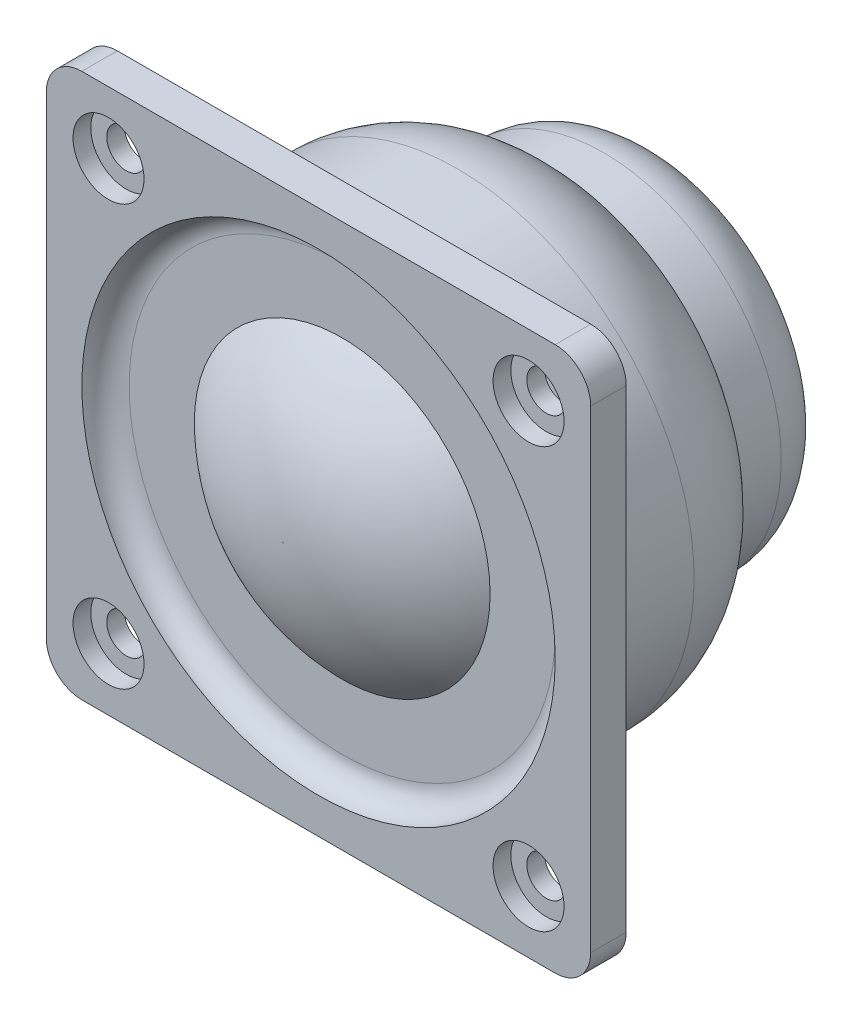
ISO-10303-21;
HEADER;
FILE_DESCRIPTION(('STEP AP214'),'2;1');
FILE_NAME('part.step','',(''),(''),'','','');
FILE_SCHEMA(('AUTOMOTIVE_DESIGN { 1 0 10303 214 1 1 1 1 }'));
ENDSEC;
DATA;
#1=APPLICATION_CONTEXT('core data for automotive mechanical design processes');
#2=APPLICATION_PROTOCOL_DEFINITION('international standard','automotive_design',2000,#1);
#3=PRODUCT_CONTEXT('',#1,'mechanical');
#4=PRODUCT('Part','Part','',(#3));
#5=PRODUCT_RELATED_PRODUCT_CATEGORY('part','',(#4));
#6=PRODUCT_DEFINITION_FORMATION('','',#4);
#7=PRODUCT_DEFINITION_CONTEXT('part definition',#1,'design');
#8=PRODUCT_DEFINITION('design','',#6,#7);
#9=PRODUCT_DEFINITION_SHAPE('','',#8);
#10=(LENGTH_UNIT() NAMED_UNIT(*) SI_UNIT(.MILLI.,.METRE.));
#11=(NAMED_UNIT(*) PLANE_ANGLE_UNIT() SI_UNIT($,.RADIAN.));
#12=(NAMED_UNIT(*) SI_UNIT($,.STERADIAN.) SOLID_ANGLE_UNIT());
#13=UNCERTAINTY_MEASURE_WITH_UNIT(LENGTH_MEASURE(1.E-05),#10,'distance_accuracy_value','');
#14=(GEOMETRIC_REPRESENTATION_CONTEXT(3) GLOBAL_UNCERTAINTY_ASSIGNED_CONTEXT((#13)) GLOBAL_UNIT_ASSIGNED_CONTEXT((#10,
#11,#12)) REPRESENTATION_CONTEXT('',''));
#15=CARTESIAN_POINT('',(0.,0.,0.));
#16=DIRECTION('',(0.,0.,1.));
#17=DIRECTION('',(1.,0.,0.));
#18=AXIS2_PLACEMENT_3D('',#15,#16,#17);
#19=CARTESIAN_POINT('',(17.7483802077823,17.7483802077823,3.));
#20=DIRECTION('',(0.,0.,-1.));
#21=DIRECTION('',(-1.,0.,0.));
#22=AXIS2_PLACEMENT_3D('',#19,#20,#21);
#23=CYLINDRICAL_SURFACE('',#22,1.65);
#24=CARTESIAN_POINT('',(17.7483802077823,17.7483802077823,0.));
#25=DIRECTION('',(0.,0.,1.));
#26=DIRECTION('',(1.,0.,0.));
#27=AXIS2_PLACEMENT_3D('',#24,#25,#26);
#28=CIRCLE('',#27,1.65);
#29=CARTESIAN_POINT('',(19.3983802077823,17.7483802077823,0.));
#30=VERTEX_POINT('',#29);
#31=EDGE_CURVE('E136',#30,#30,#28,.T.);
#32=ORIENTED_EDGE('',*,*,#31,.F.);
#33=EDGE_LOOP('',(#32));
#34=FACE_BOUND('',#33,.T.);
#35=CARTESIAN_POINT('',(17.7483802077823,17.7483802077823,1.5));
#36=DIRECTION('',(0.,0.,1.));
#37=DIRECTION('',(1.,0.,0.));
#38=AXIS2_PLACEMENT_3D('',#35,#36,#37);
#39=CIRCLE('',#38,1.65);
#40=CARTESIAN_POINT('',(19.3983802077823,17.7483802077823,1.5));
#41=VERTEX_POINT('',#40);
#42=EDGE_CURVE('E173',#41,#41,#39,.T.);
#43=ORIENTED_EDGE('',*,*,#42,.T.);
#44=EDGE_LOOP('',(#43));
#45=FACE_BOUND('',#44,.T.);
#46=ADVANCED_FACE('F34',(#34,#45),#23,.F.);
#47=CARTESIAN_POINT('',(-17.7483802077823,17.7483802077823,3.));
#48=DIRECTION('',(0.,0.,-1.));
#49=DIRECTION('',(-1.,0.,0.));
#50=AXIS2_PLACEMENT_3D('',#47,#48,#49);
#51=CYLINDRICAL_SURFACE('',#50,1.65);
#52=CARTESIAN_POINT('',(-17.7483802077823,17.7483802077823,0.));
#53=DIRECTION('',(0.,0.,1.));
#54=DIRECTION('',(1.,0.,0.));
#55=AXIS2_PLACEMENT_3D('',#52,#53,#54);
#56=CIRCLE('',#55,1.65);
#57=CARTESIAN_POINT('',(-16.0983802077823,17.7483802077823,0.));
#58=VERTEX_POINT('',#57);
#59=EDGE_CURVE('E354',#58,#58,#56,.T.);
#60=ORIENTED_EDGE('',*,*,#59,.F.);
#61=EDGE_LOOP('',(#60));
#62=FACE_BOUND('',#61,.T.);
#63=CARTESIAN_POINT('',(-17.7483802077823,17.7483802077823,1.5));
#64=DIRECTION('',(0.,0.,1.));
#65=DIRECTION('',(1.,0.,0.));
#66=AXIS2_PLACEMENT_3D('',#63,#64,#65);
#67=CIRCLE('',#66,1.65);
#68=CARTESIAN_POINT('',(-16.0983802077823,17.7483802077823,1.5));
#69=VERTEX_POINT('',#68);
#70=EDGE_CURVE('E170',#69,#69,#67,.T.);
#71=ORIENTED_EDGE('',*,*,#70,.T.);
#72=EDGE_LOOP('',(#71));
#73=FACE_BOUND('',#72,.T.);
#74=ADVANCED_FACE('F206',(#62,#73),#51,.F.);
#75=CARTESIAN_POINT('',(17.7483802077823,-17.7483802077823,3.));
#76=DIRECTION('',(0.,0.,-1.));
#77=DIRECTION('',(-1.,0.,0.));
#78=AXIS2_PLACEMENT_3D('',#75,#76,#77);
#79=CYLINDRICAL_SURFACE('',#78,1.65);
#80=CARTESIAN_POINT('',(17.7483802077823,-17.7483802077823,0.));
#81=DIRECTION('',(0.,0.,1.));
#82=DIRECTION('',(1.,0.,0.));
#83=AXIS2_PLACEMENT_3D('',#80,#81,#82);
#84=CIRCLE('',#83,1.65);
#85=CARTESIAN_POINT('',(19.3983802077823,-17.7483802077823,0.));
#86=VERTEX_POINT('',#85);
#87=EDGE_CURVE('E323',#86,#86,#84,.T.);
#88=ORIENTED_EDGE('',*,*,#87,.F.);
#89=EDGE_LOOP('',(#88));
#90=FACE_BOUND('',#89,.T.);
#91=CARTESIAN_POINT('',(17.7483802077823,-17.7483802077823,1.5));
#92=DIRECTION('',(0.,0.,1.));
#93=DIRECTION('',(1.,0.,0.));
#94=AXIS2_PLACEMENT_3D('',#91,#92,#93);
#95=CIRCLE('',#94,1.65);
#96=CARTESIAN_POINT('',(19.3983802077823,-17.7483802077823,1.5));
#97=VERTEX_POINT('',#96);
#98=EDGE_CURVE('E166',#97,#97,#95,.T.);
#99=ORIENTED_EDGE('',*,*,#98,.T.);
#100=EDGE_LOOP('',(#99));
#101=FACE_BOUND('',#100,.T.);
#102=ADVANCED_FACE('F212',(#90,#101),#79,.F.);
#103=CARTESIAN_POINT('',(-17.7483802077823,-17.7483802077823,3.));
#104=DIRECTION('',(0.,0.,-1.));
#105=DIRECTION('',(-1.,0.,0.));
#106=AXIS2_PLACEMENT_3D('',#103,#104,#105);
#107=CYLINDRICAL_SURFACE('',#106,1.65);
#108=CARTESIAN_POINT('',(-17.7483802077823,-17.7483802077823,0.));
#109=DIRECTION('',(0.,0.,1.));
#110=DIRECTION('',(1.,0.,0.));
#111=AXIS2_PLACEMENT_3D('',#108,#109,#110);
#112=CIRCLE('',#111,1.65);
#113=CARTESIAN_POINT('',(-16.0983802077823,-17.7483802077823,0.));
#114=VERTEX_POINT('',#113);
#115=EDGE_CURVE('E176',#114,#114,#112,.T.);
#116=ORIENTED_EDGE('',*,*,#115,.F.);
#117=EDGE_LOOP('',(#116));
#118=FACE_BOUND('',#117,.T.);
#119=CARTESIAN_POINT('',(-17.7483802077823,-17.7483802077823,1.5));
#120=DIRECTION('',(0.,0.,1.));
#121=DIRECTION('',(1.,0.,0.));
#122=AXIS2_PLACEMENT_3D('',#119,#120,#121);
#123=CIRCLE('',#122,1.65);
#124=CARTESIAN_POINT('',(-16.0983802077823,-17.7483802077823,1.5));
#125=VERTEX_POINT('',#124);
#126=EDGE_CURVE('E163',#125,#125,#123,.T.);
#127=ORIENTED_EDGE('',*,*,#126,.T.);
#128=EDGE_LOOP('',(#127));
#129=FACE_BOUND('',#128,.T.);
#130=ADVANCED_FACE('F222',(#118,#129),#107,.F.);
#131=CARTESIAN_POINT('',(-20.,-20.,3.));
#132=DIRECTION('',(0.,0.,1.));
#133=DIRECTION('',(1.,0.,0.));
#134=AXIS2_PLACEMENT_3D('',#131,#132,#133);
#135=PLANE('',#134);
#136=CARTESIAN_POINT('',(0.,0.,3.));
#137=DIRECTION('',(0.,0.,1.));
#138=DIRECTION('',(1.,0.,0.));
#139=AXIS2_PLACEMENT_3D('',#136,#137,#138);
#140=CIRCLE('',#139,20.);
#141=CARTESIAN_POINT('',(20.,0.,3.));
#142=VERTEX_POINT('',#141);
#143=EDGE_CURVE('E345',#142,#142,#140,.T.);
#144=ORIENTED_EDGE('',*,*,#143,.F.);
#145=EDGE_LOOP('',(#144));
#146=FACE_BOUND('',#145,.T.);
#147=CARTESIAN_POINT('',(-17.7483802077823,-17.7483802077823,3.));
#148=DIRECTION('',(0.,0.,1.));
#149=DIRECTION('',(1.,0.,0.));
#150=AXIS2_PLACEMENT_3D('',#147,#148,#149);
#151=CIRCLE('',#150,3.);
#152=CARTESIAN_POINT('',(-14.7483802077823,-17.7483802077823,3.));
#153=VERTEX_POINT('',#152);
#154=EDGE_CURVE('E342',#153,#153,#151,.T.);
#155=ORIENTED_EDGE('',*,*,#154,.F.);
#156=EDGE_LOOP('',(#155));
#157=FACE_BOUND('',#156,.T.);
#158=CARTESIAN_POINT('',(17.7483802077823,-17.7483802077823,3.));
#159=DIRECTION('',(0.,0.,1.));
#160=DIRECTION('',(1.,0.,0.));
#161=AXIS2_PLACEMENT_3D('',#158,#159,#160);
#162=CIRCLE('',#161,3.);
#163=CARTESIAN_POINT('',(20.7483802077823,-17.7483802077823,3.));
#164=VERTEX_POINT('',#163);
#165=EDGE_CURVE('E330',#164,#164,#162,.T.);
#166=ORIENTED_EDGE('',*,*,#165,.F.);
#167=EDGE_LOOP('',(#166));
#168=FACE_BOUND('',#167,.T.);
#169=CARTESIAN_POINT('',(17.7483802077823,17.7483802077823,3.));
#170=DIRECTION('',(0.,0.,1.));
#171=DIRECTION('',(1.,0.,0.));
#172=AXIS2_PLACEMENT_3D('',#169,#170,#171);
#173=CIRCLE('',#172,3.);
#174=CARTESIAN_POINT('',(20.7483802077823,17.7483802077823,3.));
#175=VERTEX_POINT('',#174);
#176=EDGE_CURVE('E329',#175,#175,#173,.T.);
#177=ORIENTED_EDGE('',*,*,#176,.F.);
#178=EDGE_LOOP('',(#177));
#179=FACE_BOUND('',#178,.T.);
#180=CARTESIAN_POINT('',(-17.7483802077823,17.7483802077823,3.));
#181=DIRECTION('',(0.,0.,1.));
#182=DIRECTION('',(1.,0.,0.));
#183=AXIS2_PLACEMENT_3D('',#180,#181,#182);
#184=CIRCLE('',#183,3.);
#185=CARTESIAN_POINT('',(-14.7483802077823,17.7483802077823,3.));
#186=VERTEX_POINT('',#185);
#187=EDGE_CURVE('E348',#186,#186,#184,.T.);
#188=ORIENTED_EDGE('',*,*,#187,.F.);
#189=EDGE_LOOP('',(#188));
#190=FACE_BOUND('',#189,.T.);
#191=CARTESIAN_POINT('',(-20.,-20.,3.));
#192=DIRECTION('',(0.,0.,1.));
#193=DIRECTION('',(1.,0.,0.));
#194=AXIS2_PLACEMENT_3D('',#191,#192,#193);
#195=CIRCLE('',#194,3.);
#196=CARTESIAN_POINT('',(-23.,-20.,3.));
#197=VERTEX_POINT('',#196);
#198=CARTESIAN_POINT('',(-20.,-23.,3.));
#199=VERTEX_POINT('',#198);
#200=EDGE_CURVE('E147',#197,#199,#195,.T.);
#201=ORIENTED_EDGE('',*,*,#200,.T.);
#202=DIRECTION('',(1.,0.,0.));
#203=VECTOR('',#202,1.);
#204=CARTESIAN_POINT('',(-20.,-23.,3.));
#205=LINE('',#204,#203);
#206=CARTESIAN_POINT('',(20.,-23.,3.));
#207=VERTEX_POINT('',#206);
#208=EDGE_CURVE('E95',#199,#207,#205,.T.);
#209=ORIENTED_EDGE('',*,*,#208,.T.);
#210=CARTESIAN_POINT('',(20.,-20.,3.));
#211=DIRECTION('',(0.,0.,1.));
#212=DIRECTION('',(1.,0.,0.));
#213=AXIS2_PLACEMENT_3D('',#210,#211,#212);
#214=CIRCLE('',#213,2.99999999999999);
#215=CARTESIAN_POINT('',(23.,-20.,3.));
#216=VERTEX_POINT('',#215);
#217=EDGE_CURVE('E361',#207,#216,#214,.T.);
#218=ORIENTED_EDGE('',*,*,#217,.T.);
#219=DIRECTION('',(0.,1.,0.));
#220=VECTOR('',#219,1.);
#221=CARTESIAN_POINT('',(23.,20.,3.));
#222=LINE('',#221,#220);
#223=CARTESIAN_POINT('',(23.,20.,3.));
#224=VERTEX_POINT('',#223);
#225=EDGE_CURVE('E363',#216,#224,#222,.T.);
#226=ORIENTED_EDGE('',*,*,#225,.T.);
#227=CARTESIAN_POINT('',(20.,20.,3.));
#228=DIRECTION('',(0.,0.,1.));
#229=DIRECTION('',(-1.,0.,0.));
#230=AXIS2_PLACEMENT_3D('',#227,#228,#229);
#231=CIRCLE('',#230,3.);
#232=CARTESIAN_POINT('',(20.,23.,3.));
#233=VERTEX_POINT('',#232);
#234=EDGE_CURVE('E114',#224,#233,#231,.T.);
#235=ORIENTED_EDGE('',*,*,#234,.T.);
#236=DIRECTION('',(-1.,0.,0.));
#237=VECTOR('',#236,1.);
#238=CARTESIAN_POINT('',(-20.,23.,3.));
#239=LINE('',#238,#237);
#240=CARTESIAN_POINT('',(-20.,23.,3.));
#241=VERTEX_POINT('',#240);
#242=EDGE_CURVE('E108',#233,#241,#239,.T.);
#243=ORIENTED_EDGE('',*,*,#242,.T.);
#244=CARTESIAN_POINT('',(-20.,20.,3.));
#245=DIRECTION('',(0.,0.,1.));
#246=DIRECTION('',(1.,0.,0.));
#247=AXIS2_PLACEMENT_3D('',#244,#245,#246);
#248=CIRCLE('',#247,3.);
#249=CARTESIAN_POINT('',(-23.,20.,3.));
#250=VERTEX_POINT('',#249);
#251=EDGE_CURVE('E112',#241,#250,#248,.T.);
#252=ORIENTED_EDGE('',*,*,#251,.T.);
#253=DIRECTION('',(0.,-1.,0.));
#254=VECTOR('',#253,1.);
#255=CARTESIAN_POINT('',(-23.,20.,3.));
#256=LINE('',#255,#254);
#257=EDGE_CURVE('E51',#250,#197,#256,.T.);
#258=ORIENTED_EDGE('',*,*,#257,.T.);
#259=EDGE_LOOP('',(#201,#209,#218,#226,#235,#243,#252,#258));
#260=FACE_BOUND('',#259,.T.);
#261=ADVANCED_FACE('F110',(#146,#157,#168,#179,#190,#260),#135,.T.);
#262=CARTESIAN_POINT('',(-20.,-20.,0.));
#263=DIRECTION('',(0.,0.,1.));
#264=DIRECTION('',(1.,0.,0.));
#265=AXIS2_PLACEMENT_3D('',#262,#263,#264);
#266=PLANE('',#265);
#267=CARTESIAN_POINT('',(0.,0.,0.));
#268=DIRECTION('',(0.,0.,1.));
#269=DIRECTION('',(1.,0.,0.));
#270=AXIS2_PLACEMENT_3D('',#267,#268,#269);
#271=CIRCLE('',#270,20.);
#272=CARTESIAN_POINT('',(20.,0.,0.));
#273=VERTEX_POINT('',#272);
#274=EDGE_CURVE('E162',#273,#273,#271,.F.);
#275=ORIENTED_EDGE('',*,*,#274,.F.);
#276=EDGE_LOOP('',(#275));
#277=FACE_BOUND('',#276,.T.);
#278=CARTESIAN_POINT('',(-20.,-20.,0.));
#279=DIRECTION('',(0.,0.,1.));
#280=DIRECTION('',(1.,0.,0.));
#281=AXIS2_PLACEMENT_3D('',#278,#279,#280);
#282=CIRCLE('',#281,3.);
#283=CARTESIAN_POINT('',(-23.,-20.,0.));
#284=VERTEX_POINT('',#283);
#285=CARTESIAN_POINT('',(-20.,-23.,0.));
#286=VERTEX_POINT('',#285);
#287=EDGE_CURVE('E132',#284,#286,#282,.T.);
#288=ORIENTED_EDGE('',*,*,#287,.F.);
#289=DIRECTION('',(0.,-1.,0.));
#290=VECTOR('',#289,1.);
#291=CARTESIAN_POINT('',(-23.,20.,0.));
#292=LINE('',#291,#290);
#293=CARTESIAN_POINT('',(-23.,20.,0.));
#294=VERTEX_POINT('',#293);
#295=EDGE_CURVE('E86',#294,#284,#292,.T.);
#296=ORIENTED_EDGE('',*,*,#295,.F.);
#297=CARTESIAN_POINT('',(-20.,20.,0.));
#298=DIRECTION('',(0.,0.,1.));
#299=DIRECTION('',(1.,0.,0.));
#300=AXIS2_PLACEMENT_3D('',#297,#298,#299);
#301=CIRCLE('',#300,3.);
#302=CARTESIAN_POINT('',(-20.,23.,0.));
#303=VERTEX_POINT('',#302);
#304=EDGE_CURVE('E80',#303,#294,#301,.T.);
#305=ORIENTED_EDGE('',*,*,#304,.F.);
#306=DIRECTION('',(-1.,0.,0.));
#307=VECTOR('',#306,1.);
#308=CARTESIAN_POINT('',(-20.,23.,0.));
#309=LINE('',#308,#307);
#310=CARTESIAN_POINT('',(20.,23.,0.));
#311=VERTEX_POINT('',#310);
#312=EDGE_CURVE('E122',#311,#303,#309,.T.);
#313=ORIENTED_EDGE('',*,*,#312,.F.);
#314=CARTESIAN_POINT('',(20.,20.,0.));
#315=DIRECTION('',(0.,0.,1.));
#316=DIRECTION('',(-1.,0.,0.));
#317=AXIS2_PLACEMENT_3D('',#314,#315,#316);
#318=CIRCLE('',#317,3.);
#319=CARTESIAN_POINT('',(23.,20.,0.));
#320=VERTEX_POINT('',#319);
#321=EDGE_CURVE('E142',#320,#311,#318,.T.);
#322=ORIENTED_EDGE('',*,*,#321,.F.);
#323=DIRECTION('',(0.,1.,0.));
#324=VECTOR('',#323,1.);
#325=CARTESIAN_POINT('',(23.,20.,0.));
#326=LINE('',#325,#324);
#327=CARTESIAN_POINT('',(23.,-20.,0.));
#328=VERTEX_POINT('',#327);
#329=EDGE_CURVE('E140',#328,#320,#326,.T.);
#330=ORIENTED_EDGE('',*,*,#329,.F.);
#331=CARTESIAN_POINT('',(20.,-20.,0.));
#332=DIRECTION('',(0.,0.,1.));
#333=DIRECTION('',(1.,0.,0.));
#334=AXIS2_PLACEMENT_3D('',#331,#332,#333);
#335=CIRCLE('',#334,2.99999999999999);
#336=CARTESIAN_POINT('',(20.,-23.,0.));
#337=VERTEX_POINT('',#336);
#338=EDGE_CURVE('E138',#337,#328,#335,.T.);
#339=ORIENTED_EDGE('',*,*,#338,.F.);
#340=DIRECTION('',(1.,0.,0.));
#341=VECTOR('',#340,1.);
#342=CARTESIAN_POINT('',(-20.,-23.,0.));
#343=LINE('',#342,#341);
#344=EDGE_CURVE('E135',#286,#337,#343,.T.);
#345=ORIENTED_EDGE('',*,*,#344,.F.);
#346=EDGE_LOOP('',(#288,#296,#305,#313,#322,#330,#339,#345));
#347=FACE_BOUND('',#346,.T.);
#348=ORIENTED_EDGE('',*,*,#31,.T.);
#349=EDGE_LOOP('',(#348));
#350=FACE_BOUND('',#349,.T.);
#351=ORIENTED_EDGE('',*,*,#59,.T.);
#352=EDGE_LOOP('',(#351));
#353=FACE_BOUND('',#352,.T.);
#354=ORIENTED_EDGE('',*,*,#87,.T.);
#355=EDGE_LOOP('',(#354));
#356=FACE_BOUND('',#355,.T.);
#357=ORIENTED_EDGE('',*,*,#115,.T.);
#358=EDGE_LOOP('',(#357));
#359=FACE_BOUND('',#358,.T.);
#360=ADVANCED_FACE('F221',(#277,#347,#350,#353,#356,#359),#266,.F.);
#361=CARTESIAN_POINT('',(-20.,-20.,3.));
#362=DIRECTION('',(0.,0.,-1.));
#363=DIRECTION('',(-1.,0.,0.));
#364=AXIS2_PLACEMENT_3D('',#361,#362,#363);
#365=CYLINDRICAL_SURFACE('',#364,3.);
#366=ORIENTED_EDGE('',*,*,#287,.T.);
#367=DIRECTION('',(0.,0.,-1.));
#368=VECTOR('',#367,1.);
#369=CARTESIAN_POINT('',(-20.,-23.,3.));
#370=LINE('',#369,#368);
#371=EDGE_CURVE('E160',#199,#286,#370,.T.);
#372=ORIENTED_EDGE('',*,*,#371,.F.);
#373=ORIENTED_EDGE('',*,*,#200,.F.);
#374=DIRECTION('',(0.,0.,-1.));
#375=VECTOR('',#374,1.);
#376=CARTESIAN_POINT('',(-23.,-20.,3.));
#377=LINE('',#376,#375);
#378=EDGE_CURVE('E128',#197,#284,#377,.T.);
#379=ORIENTED_EDGE('',*,*,#378,.T.);
#380=EDGE_LOOP('',(#366,#372,#373,#379));
#381=FACE_BOUND('',#380,.T.);
#382=ADVANCED_FACE('F226',(#381),#365,.T.);
#383=CARTESIAN_POINT('',(-20.,-23.,3.));
#384=DIRECTION('',(0.,1.,0.));
#385=DIRECTION('',(-1.,0.,0.));
#386=AXIS2_PLACEMENT_3D('',#383,#384,#385);
#387=PLANE('',#386);
#388=ORIENTED_EDGE('',*,*,#344,.T.);
#389=DIRECTION('',(0.,0.,-1.));
#390=VECTOR('',#389,1.);
#391=CARTESIAN_POINT('',(20.,-23.,3.));
#392=LINE('',#391,#390);
#393=EDGE_CURVE('E157',#207,#337,#392,.T.);
#394=ORIENTED_EDGE('',*,*,#393,.F.);
#395=ORIENTED_EDGE('',*,*,#208,.F.);
#396=ORIENTED_EDGE('',*,*,#371,.T.);
#397=EDGE_LOOP('',(#388,#394,#395,#396));
#398=FACE_BOUND('',#397,.T.);
#399=ADVANCED_FACE('F247',(#398),#387,.F.);
#400=CARTESIAN_POINT('',(20.,-20.,3.));
#401=DIRECTION('',(0.,0.,-1.));
#402=DIRECTION('',(-1.,0.,0.));
#403=AXIS2_PLACEMENT_3D('',#400,#401,#402);
#404=CYLINDRICAL_SURFACE('',#403,2.99999999999999);
#405=ORIENTED_EDGE('',*,*,#338,.T.);
#406=DIRECTION('',(0.,0.,-1.));
#407=VECTOR('',#406,1.);
#408=CARTESIAN_POINT('',(23.,-20.,3.));
#409=LINE('',#408,#407);
#410=EDGE_CURVE('E154',#216,#328,#409,.T.);
#411=ORIENTED_EDGE('',*,*,#410,.F.);
#412=ORIENTED_EDGE('',*,*,#217,.F.);
#413=ORIENTED_EDGE('',*,*,#393,.T.);
#414=EDGE_LOOP('',(#405,#411,#412,#413));
#415=FACE_BOUND('',#414,.T.);
#416=ADVANCED_FACE('F243',(#415),#404,.T.);
#417=CARTESIAN_POINT('',(23.,20.,3.));
#418=DIRECTION('',(-1.,0.,0.));
#419=DIRECTION('',(0.,0.,1.));
#420=AXIS2_PLACEMENT_3D('',#417,#418,#419);
#421=PLANE('',#420);
#422=ORIENTED_EDGE('',*,*,#329,.T.);
#423=DIRECTION('',(0.,0.,-1.));
#424=VECTOR('',#423,1.);
#425=CARTESIAN_POINT('',(23.,20.,3.));
#426=LINE('',#425,#424);
#427=EDGE_CURVE('E151',#224,#320,#426,.T.);
#428=ORIENTED_EDGE('',*,*,#427,.F.);
#429=ORIENTED_EDGE('',*,*,#225,.F.);
#430=ORIENTED_EDGE('',*,*,#410,.T.);
#431=EDGE_LOOP('',(#422,#428,#429,#430));
#432=FACE_BOUND('',#431,.T.);
#433=ADVANCED_FACE('F239',(#432),#421,.F.);
#434=CARTESIAN_POINT('',(20.,20.,3.));
#435=DIRECTION('',(0.,0.,-1.));
#436=DIRECTION('',(-1.,0.,0.));
#437=AXIS2_PLACEMENT_3D('',#434,#435,#436);
#438=CYLINDRICAL_SURFACE('',#437,3.);
#439=ORIENTED_EDGE('',*,*,#321,.T.);
#440=DIRECTION('',(0.,0.,-1.));
#441=VECTOR('',#440,1.);
#442=CARTESIAN_POINT('',(20.,23.,3.));
#443=LINE('',#442,#441);
#444=EDGE_CURVE('E123',#233,#311,#443,.T.);
#445=ORIENTED_EDGE('',*,*,#444,.F.);
#446=ORIENTED_EDGE('',*,*,#234,.F.);
#447=ORIENTED_EDGE('',*,*,#427,.T.);
#448=EDGE_LOOP('',(#439,#445,#446,#447));
#449=FACE_BOUND('',#448,.T.);
#450=ADVANCED_FACE('F236',(#449),#438,.T.);
#451=CARTESIAN_POINT('',(-20.,23.,3.));
#452=DIRECTION('',(0.,-1.,0.));
#453=DIRECTION('',(0.,0.,-1.));
#454=AXIS2_PLACEMENT_3D('',#451,#452,#453);
#455=PLANE('',#454);
#456=ORIENTED_EDGE('',*,*,#312,.T.);
#457=DIRECTION('',(0.,0.,-1.));
#458=VECTOR('',#457,1.);
#459=CARTESIAN_POINT('',(-20.,23.,3.));
#460=LINE('',#459,#458);
#461=EDGE_CURVE('E119',#241,#303,#460,.T.);
#462=ORIENTED_EDGE('',*,*,#461,.F.);
#463=ORIENTED_EDGE('',*,*,#242,.F.);
#464=ORIENTED_EDGE('',*,*,#444,.T.);
#465=EDGE_LOOP('',(#456,#462,#463,#464));
#466=FACE_BOUND('',#465,.T.);
#467=ADVANCED_FACE('F120',(#466),#455,.F.);
#468=CARTESIAN_POINT('',(-20.,20.,3.));
#469=DIRECTION('',(0.,0.,-1.));
#470=DIRECTION('',(-1.,0.,0.));
#471=AXIS2_PLACEMENT_3D('',#468,#469,#470);
#472=CYLINDRICAL_SURFACE('',#471,3.);
#473=ORIENTED_EDGE('',*,*,#304,.T.);
#474=DIRECTION('',(0.,0.,-1.));
#475=VECTOR('',#474,1.);
#476=CARTESIAN_POINT('',(-23.,20.,3.));
#477=LINE('',#476,#475);
#478=EDGE_CURVE('E124',#250,#294,#477,.T.);
#479=ORIENTED_EDGE('',*,*,#478,.F.);
#480=ORIENTED_EDGE('',*,*,#251,.F.);
#481=ORIENTED_EDGE('',*,*,#461,.T.);
#482=EDGE_LOOP('',(#473,#479,#480,#481));
#483=FACE_BOUND('',#482,.T.);
#484=ADVANCED_FACE('F126',(#483),#472,.T.);
#485=CARTESIAN_POINT('',(-23.,20.,3.));
#486=DIRECTION('',(1.,0.,0.));
#487=DIRECTION('',(0.,1.,0.));
#488=AXIS2_PLACEMENT_3D('',#485,#486,#487);
#489=PLANE('',#488);
#490=ORIENTED_EDGE('',*,*,#295,.T.);
#491=ORIENTED_EDGE('',*,*,#378,.F.);
#492=ORIENTED_EDGE('',*,*,#257,.F.);
#493=ORIENTED_EDGE('',*,*,#478,.T.);
#494=EDGE_LOOP('',(#490,#491,#492,#493));
#495=FACE_BOUND('',#494,.T.);
#496=ADVANCED_FACE('F228',(#495),#489,.F.);
#497=CARTESIAN_POINT('',(-17.7483802077823,-17.7483802077823,1.5));
#498=DIRECTION('',(0.,0.,1.));
#499=DIRECTION('',(1.,0.,0.));
#500=AXIS2_PLACEMENT_3D('',#497,#498,#499);
#501=CYLINDRICAL_SURFACE('',#500,3.);
#502=CARTESIAN_POINT('',(-17.7483802077823,-17.7483802077823,1.5));
#503=DIRECTION('',(0.,0.,1.));
#504=DIRECTION('',(1.,0.,0.));
#505=AXIS2_PLACEMENT_3D('',#502,#503,#504);
#506=CIRCLE('',#505,3.);
#507=CARTESIAN_POINT('',(-14.7483802077823,-17.7483802077823,1.5));
#508=VERTEX_POINT('',#507);
#509=EDGE_CURVE('E336',#508,#508,#506,.T.);
#510=ORIENTED_EDGE('',*,*,#509,.F.);
#511=EDGE_LOOP('',(#510));
#512=FACE_BOUND('',#511,.T.);
#513=ORIENTED_EDGE('',*,*,#154,.T.);
#514=EDGE_LOOP('',(#513));
#515=FACE_BOUND('',#514,.T.);
#516=ADVANCED_FACE('F231',(#512,#515),#501,.F.);
#517=CARTESIAN_POINT('',(-17.7483802077823,-17.7483802077823,1.5));
#518=DIRECTION('',(0.,0.,1.));
#519=DIRECTION('',(1.,0.,0.));
#520=AXIS2_PLACEMENT_3D('',#517,#518,#519);
#521=PLANE('',#520);
#522=ORIENTED_EDGE('',*,*,#126,.F.);
#523=EDGE_LOOP('',(#522));
#524=FACE_BOUND('',#523,.T.);
#525=ORIENTED_EDGE('',*,*,#509,.T.);
#526=EDGE_LOOP('',(#525));
#527=FACE_BOUND('',#526,.T.);
#528=ADVANCED_FACE('F300',(#524,#527),#521,.T.);
#529=CARTESIAN_POINT('',(17.7483802077823,-17.7483802077823,1.5));
#530=DIRECTION('',(0.,0.,1.));
#531=DIRECTION('',(1.,0.,0.));
#532=AXIS2_PLACEMENT_3D('',#529,#530,#531);
#533=CYLINDRICAL_SURFACE('',#532,3.);
#534=CARTESIAN_POINT('',(17.7483802077823,-17.7483802077823,1.5));
#535=DIRECTION('',(0.,0.,1.));
#536=DIRECTION('',(1.,0.,0.));
#537=AXIS2_PLACEMENT_3D('',#534,#535,#536);
#538=CIRCLE('',#537,3.);
#539=CARTESIAN_POINT('',(20.7483802077823,-17.7483802077823,1.5));
#540=VERTEX_POINT('',#539);
#541=EDGE_CURVE('E328',#540,#540,#538,.T.);
#542=ORIENTED_EDGE('',*,*,#541,.F.);
#543=EDGE_LOOP('',(#542));
#544=FACE_BOUND('',#543,.T.);
#545=ORIENTED_EDGE('',*,*,#165,.T.);
#546=EDGE_LOOP('',(#545));
#547=FACE_BOUND('',#546,.T.);
#548=ADVANCED_FACE('F296',(#544,#547),#533,.F.);
#549=CARTESIAN_POINT('',(17.7483802077823,-17.7483802077823,1.5));
#550=DIRECTION('',(0.,0.,1.));
#551=DIRECTION('',(1.,0.,0.));
#552=AXIS2_PLACEMENT_3D('',#549,#550,#551);
#553=PLANE('',#552);
#554=ORIENTED_EDGE('',*,*,#98,.F.);
#555=EDGE_LOOP('',(#554));
#556=FACE_BOUND('',#555,.T.);
#557=ORIENTED_EDGE('',*,*,#541,.T.);
#558=EDGE_LOOP('',(#557));
#559=FACE_BOUND('',#558,.T.);
#560=ADVANCED_FACE('F292',(#556,#559),#553,.T.);
#561=CARTESIAN_POINT('',(-17.7483802077823,17.7483802077823,1.5));
#562=DIRECTION('',(0.,0.,1.));
#563=DIRECTION('',(1.,0.,0.));
#564=AXIS2_PLACEMENT_3D('',#561,#562,#563);
#565=CYLINDRICAL_SURFACE('',#564,3.);
#566=CARTESIAN_POINT('',(-17.7483802077823,17.7483802077823,1.5));
#567=DIRECTION('',(0.,0.,1.));
#568=DIRECTION('',(1.,0.,0.));
#569=AXIS2_PLACEMENT_3D('',#566,#567,#568);
#570=CIRCLE('',#569,3.);
#571=CARTESIAN_POINT('',(-14.7483802077823,17.7483802077823,1.5));
#572=VERTEX_POINT('',#571);
#573=EDGE_CURVE('E167',#572,#572,#570,.T.);
#574=ORIENTED_EDGE('',*,*,#573,.F.);
#575=EDGE_LOOP('',(#574));
#576=FACE_BOUND('',#575,.T.);
#577=ORIENTED_EDGE('',*,*,#187,.T.);
#578=EDGE_LOOP('',(#577));
#579=FACE_BOUND('',#578,.T.);
#580=ADVANCED_FACE('F295',(#576,#579),#565,.F.);
#581=CARTESIAN_POINT('',(-17.7483802077823,17.7483802077823,1.5));
#582=DIRECTION('',(0.,0.,1.));
#583=DIRECTION('',(1.,0.,0.));
#584=AXIS2_PLACEMENT_3D('',#581,#582,#583);
#585=PLANE('',#584);
#586=ORIENTED_EDGE('',*,*,#70,.F.);
#587=EDGE_LOOP('',(#586));
#588=FACE_BOUND('',#587,.T.);
#589=ORIENTED_EDGE('',*,*,#573,.T.);
#590=EDGE_LOOP('',(#589));
#591=FACE_BOUND('',#590,.T.);
#592=ADVANCED_FACE('F290',(#588,#591),#585,.T.);
#593=CARTESIAN_POINT('',(17.7483802077823,17.7483802077823,1.5));
#594=DIRECTION('',(0.,0.,1.));
#595=DIRECTION('',(1.,0.,0.));
#596=AXIS2_PLACEMENT_3D('',#593,#594,#595);
#597=CYLINDRICAL_SURFACE('',#596,3.);
#598=CARTESIAN_POINT('',(17.7483802077823,17.7483802077823,1.5));
#599=DIRECTION('',(0.,0.,1.));
#600=DIRECTION('',(1.,0.,0.));
#601=AXIS2_PLACEMENT_3D('',#598,#599,#600);
#602=CIRCLE('',#601,3.);
#603=CARTESIAN_POINT('',(20.7483802077823,17.7483802077823,1.5));
#604=VERTEX_POINT('',#603);
#605=EDGE_CURVE('E333',#604,#604,#602,.T.);
#606=ORIENTED_EDGE('',*,*,#605,.F.);
#607=EDGE_LOOP('',(#606));
#608=FACE_BOUND('',#607,.T.);
#609=ORIENTED_EDGE('',*,*,#176,.T.);
#610=EDGE_LOOP('',(#609));
#611=FACE_BOUND('',#610,.T.);
#612=ADVANCED_FACE('F286',(#608,#611),#597,.F.);
#613=CARTESIAN_POINT('',(17.7483802077823,17.7483802077823,1.5));
#614=DIRECTION('',(0.,0.,1.));
#615=DIRECTION('',(1.,0.,0.));
#616=AXIS2_PLACEMENT_3D('',#613,#614,#615);
#617=PLANE('',#616);
#618=ORIENTED_EDGE('',*,*,#42,.F.);
#619=EDGE_LOOP('',(#618));
#620=FACE_BOUND('',#619,.T.);
#621=ORIENTED_EDGE('',*,*,#605,.T.);
#622=EDGE_LOOP('',(#621));
#623=FACE_BOUND('',#622,.T.);
#624=ADVANCED_FACE('F282',(#620,#623),#617,.T.);
#625=CARTESIAN_POINT('',(0.,0.,-17.4));
#626=DIRECTION('',(0.,0.,1.));
#627=DIRECTION('',(1.,0.,0.));
#628=AXIS2_PLACEMENT_3D('',#625,#626,#627);
#629=CYLINDRICAL_SURFACE('',#628,20.);
#630=CARTESIAN_POINT('',(0.,0.,-8.73974596215561));
#631=DIRECTION('',(0.,0.,-1.));
#632=DIRECTION('',(-1.,0.,0.));
#633=AXIS2_PLACEMENT_3D('',#630,#631,#632);
#634=CIRCLE('',#633,20.);
#635=CARTESIAN_POINT('',(-20.,0.,-8.73974596215561));
#636=VERTEX_POINT('',#635);
#637=EDGE_CURVE('E180',#636,#636,#634,.F.);
#638=ORIENTED_EDGE('',*,*,#637,.T.);
#639=EDGE_LOOP('',(#638));
#640=FACE_BOUND('',#639,.T.);
#641=ORIENTED_EDGE('',*,*,#274,.T.);
#642=EDGE_LOOP('',(#641));
#643=FACE_BOUND('',#642,.T.);
#644=ADVANCED_FACE('F276',(#640,#643),#629,.T.);
#645=CARTESIAN_POINT('',(0.,0.,-26.1));
#646=DIRECTION('',(0.,0.,1.));
#647=DIRECTION('',(1.,0.,0.));
#648=AXIS2_PLACEMENT_3D('',#645,#646,#647);
#649=CYLINDRICAL_SURFACE('',#648,15.);
#650=CARTESIAN_POINT('',(0.,0.,-21.1));
#651=DIRECTION('',(0.,0.,-1.));
#652=DIRECTION('',(-1.,0.,0.));
#653=AXIS2_PLACEMENT_3D('',#650,#651,#652);
#654=CIRCLE('',#653,15.);
#655=CARTESIAN_POINT('',(-15.,0.,-21.1));
#656=VERTEX_POINT('',#655);
#657=EDGE_CURVE('E186',#656,#656,#654,.F.);
#658=ORIENTED_EDGE('',*,*,#657,.T.);
#659=EDGE_LOOP('',(#658));
#660=FACE_BOUND('',#659,.T.);
#661=CARTESIAN_POINT('',(0.,0.,-17.4));
#662=DIRECTION('',(0.,0.,-1.));
#663=DIRECTION('',(-1.,0.,0.));
#664=AXIS2_PLACEMENT_3D('',#661,#662,#663);
#665=CIRCLE('',#664,15.);
#666=CARTESIAN_POINT('',(-15.,0.,-17.4));
#667=VERTEX_POINT('',#666);
#668=EDGE_CURVE('E179',#667,#667,#665,.T.);
#669=ORIENTED_EDGE('',*,*,#668,.T.);
#670=EDGE_LOOP('',(#669));
#671=FACE_BOUND('',#670,.T.);
#672=ADVANCED_FACE('F271',(#660,#671),#649,.T.);
#673=CARTESIAN_POINT('',(0.,0.,-26.1));
#674=DIRECTION('',(0.,0.,-1.));
#675=DIRECTION('',(-1.,0.,0.));
#676=AXIS2_PLACEMENT_3D('',#673,#674,#675);
#677=PLANE('',#676);
#678=CARTESIAN_POINT('',(0.,0.,-26.1));
#679=DIRECTION('',(0.,0.,-1.));
#680=DIRECTION('',(-1.,0.,0.));
#681=AXIS2_PLACEMENT_3D('',#678,#679,#680);
#682=CIRCLE('',#681,10.);
#683=CARTESIAN_POINT('',(-10.,0.,-26.1));
#684=VERTEX_POINT('',#683);
#685=EDGE_CURVE('E183',#684,#684,#682,.T.);
#686=ORIENTED_EDGE('',*,*,#685,.T.);
#687=EDGE_LOOP('',(#686));
#688=FACE_BOUND('',#687,.T.);
#689=ADVANCED_FACE('F257',(#688),#677,.T.);
#690=CARTESIAN_POINT('',(0.,0.,-8.73974596215561));
#691=DIRECTION('',(0.,0.,-1.));
#692=DIRECTION('',(-1.,0.,0.));
#693=AXIS2_PLACEMENT_3D('',#690,#691,#692);
#694=DEGENERATE_TOROIDAL_SURFACE('',#693,10.,10.,.T.);
#695=ORIENTED_EDGE('',*,*,#637,.F.);
#696=EDGE_LOOP('',(#695));
#697=FACE_BOUND('',#696,.T.);
#698=ORIENTED_EDGE('',*,*,#668,.F.);
#699=EDGE_LOOP('',(#698));
#700=FACE_BOUND('',#699,.T.);
#701=ADVANCED_FACE('F254',(#697,#700),#694,.T.);
#702=CARTESIAN_POINT('',(0.,0.,-21.1));
#703=DIRECTION('',(0.,0.,-1.));
#704=DIRECTION('',(-1.,0.,0.));
#705=AXIS2_PLACEMENT_3D('',#702,#703,#704);
#706=TOROIDAL_SURFACE('',#705,10.,5.);
#707=ORIENTED_EDGE('',*,*,#657,.F.);
#708=EDGE_LOOP('',(#707));
#709=FACE_BOUND('',#708,.T.);
#710=ORIENTED_EDGE('',*,*,#685,.F.);
#711=EDGE_LOOP('',(#710));
#712=FACE_BOUND('',#711,.T.);
#713=ADVANCED_FACE('F256',(#709,#712),#706,.T.);
#714=CARTESIAN_POINT('',(0.,0.,1.));
#715=DIRECTION('',(0.,0.,1.));
#716=DIRECTION('',(1.,0.,0.));
#717=AXIS2_PLACEMENT_3D('',#714,#715,#716);
#718=PLANE('',#717);
#719=CARTESIAN_POINT('',(0.,0.,1.));
#720=DIRECTION('',(0.,0.,1.));
#721=DIRECTION('',(1.,0.,0.));
#722=AXIS2_PLACEMENT_3D('',#719,#720,#721);
#723=CIRCLE('',#722,18.);
#724=CARTESIAN_POINT('',(18.,0.,1.));
#725=VERTEX_POINT('',#724);
#726=EDGE_CURVE('E11',#725,#725,#723,.T.);
#727=ORIENTED_EDGE('',*,*,#726,.T.);
#728=EDGE_LOOP('',(#727));
#729=FACE_BOUND('',#728,.T.);
#730=CARTESIAN_POINT('',(0.,0.,1.));
#731=DIRECTION('',(0.,0.,1.));
#732=DIRECTION('',(1.,0.,0.));
#733=AXIS2_PLACEMENT_3D('',#730,#731,#732);
#734=CIRCLE('',#733,12.5);
#735=CARTESIAN_POINT('',(12.5,0.,1.));
#736=VERTEX_POINT('',#735);
#737=EDGE_CURVE('E409',#736,#736,#734,.T.);
#738=ORIENTED_EDGE('',*,*,#737,.F.);
#739=EDGE_LOOP('',(#738));
#740=FACE_BOUND('',#739,.T.);
#741=ADVANCED_FACE('F201',(#729,#740),#718,.T.);
#742=CARTESIAN_POINT('',(0.,0.,6.));
#743=DIRECTION('',(0.,0.,1.));
#744=DIRECTION('',(1.,0.,0.));
#745=AXIS2_PLACEMENT_3D('',#742,#743,#744);
#746=PLANE('',#745);
#747=CARTESIAN_POINT('',(0.,0.,6.));
#748=DIRECTION('',(0.,0.,1.));
#749=DIRECTION('',(1.,0.,0.));
#750=AXIS2_PLACEMENT_3D('',#747,#748,#749);
#751=CIRCLE('',#750,0.0501004020112689);
#752=CARTESIAN_POINT('',(0.0501004020112689,0.,6.));
#753=VERTEX_POINT('',#752);
#754=EDGE_CURVE('E43',#753,#753,#751,.T.);
#755=ORIENTED_EDGE('',*,*,#754,.T.);
#756=EDGE_LOOP('',(#755));
#757=FACE_BOUND('',#756,.T.);
#758=ADVANCED_FACE('F191',(#757),#746,.T.);
#759=CARTESIAN_POINT('',(0.,0.,-12.));
#760=DIRECTION('',(0.,0.,-1.));
#761=DIRECTION('',(-1.,0.,0.));
#762=AXIS2_PLACEMENT_3D('',#759,#760,#761);
#763=DEGENERATE_TOROIDAL_SURFACE('',#762,0.0501004020112689,18.,.T.);
#764=ORIENTED_EDGE('',*,*,#737,.T.);
#765=EDGE_LOOP('',(#764));
#766=FACE_BOUND('',#765,.T.);
#767=ORIENTED_EDGE('',*,*,#754,.F.);
#768=EDGE_LOOP('',(#767));
#769=FACE_BOUND('',#768,.T.);
#770=ADVANCED_FACE('F193',(#766,#769),#763,.T.);
#771=CARTESIAN_POINT('',(0.,0.,3.));
#772=DIRECTION('',(0.,0.,1.));
#773=DIRECTION('',(1.,0.,0.));
#774=AXIS2_PLACEMENT_3D('',#771,#772,#773);
#775=TOROIDAL_SURFACE('',#774,18.,2.);
#776=ORIENTED_EDGE('',*,*,#143,.T.);
#777=EDGE_LOOP('',(#776));
#778=FACE_BOUND('',#777,.T.);
#779=ORIENTED_EDGE('',*,*,#726,.F.);
#780=EDGE_LOOP('',(#779));
#781=FACE_BOUND('',#780,.T.);
#782=ADVANCED_FACE('F36',(#778,#781),#775,.F.);
#783=CLOSED_SHELL('',(#46,#74,#102,#130,#261,#360,#382,#399,#416,#433,#450,#467,#484,#496,#516,
#528,#548,#560,#580,#592,#612,#624,#644,#672,#689,#701,#713,#741,#758,#770,#782));
#784=MANIFOLD_SOLID_BREP('B2',#783);
#785=ADVANCED_BREP_SHAPE_REPRESENTATION('',(#18,#784),#14);
#786=SHAPE_DEFINITION_REPRESENTATION(#9,#785);
ENDSEC;
END-ISO-10303-21;
